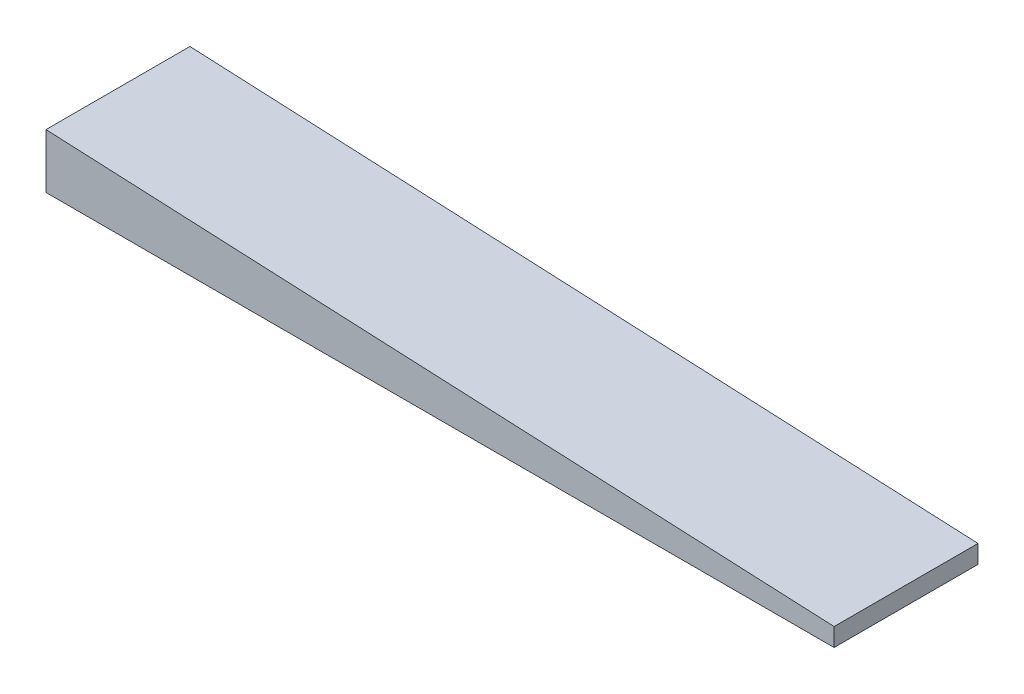
ISO-10303-21;
HEADER;
FILE_DESCRIPTION(('STEP AP214'),'2;1');
FILE_NAME('part.step','',(''),(''),'','','');
FILE_SCHEMA(('AUTOMOTIVE_DESIGN { 1 0 10303 214 1 1 1 1 }'));
ENDSEC;
DATA;
#1=APPLICATION_CONTEXT('core data for automotive mechanical design processes');
#2=APPLICATION_PROTOCOL_DEFINITION('international standard','automotive_design',2000,#1);
#3=PRODUCT_CONTEXT('',#1,'mechanical');
#4=PRODUCT('Part','Part','',(#3));
#5=PRODUCT_RELATED_PRODUCT_CATEGORY('part','',(#4));
#6=PRODUCT_DEFINITION_FORMATION('','',#4);
#7=PRODUCT_DEFINITION_CONTEXT('part definition',#1,'design');
#8=PRODUCT_DEFINITION('design','',#6,#7);
#9=PRODUCT_DEFINITION_SHAPE('','',#8);
#10=(LENGTH_UNIT() NAMED_UNIT(*) SI_UNIT(.MILLI.,.METRE.));
#11=(NAMED_UNIT(*) PLANE_ANGLE_UNIT() SI_UNIT($,.RADIAN.));
#12=(NAMED_UNIT(*) SI_UNIT($,.STERADIAN.) SOLID_ANGLE_UNIT());
#13=UNCERTAINTY_MEASURE_WITH_UNIT(LENGTH_MEASURE(1.E-05),#10,'distance_accuracy_value','');
#14=(GEOMETRIC_REPRESENTATION_CONTEXT(3) GLOBAL_UNCERTAINTY_ASSIGNED_CONTEXT((#13)) GLOBAL_UNIT_ASSIGNED_CONTEXT((#10,
#11,#12)) REPRESENTATION_CONTEXT('',''));
#15=CARTESIAN_POINT('',(0.,0.,0.));
#16=DIRECTION('',(0.,0.,1.));
#17=DIRECTION('',(1.,0.,0.));
#18=AXIS2_PLACEMENT_3D('',#15,#16,#17);
#19=CARTESIAN_POINT('',(0.,0.,38.1));
#20=DIRECTION('',(0.,-1.,0.));
#21=DIRECTION('',(0.,0.,-1.));
#22=AXIS2_PLACEMENT_3D('',#19,#20,#21);
#23=PLANE('',#22);
#24=DIRECTION('',(-1.,0.,0.));
#25=VECTOR('',#24,1.);
#26=CARTESIAN_POINT('',(0.,0.,0.));
#27=LINE('',#26,#25);
#28=CARTESIAN_POINT('',(417.2779588384,0.,0.));
#29=VERTEX_POINT('',#28);
#30=CARTESIAN_POINT('',(208.638979216,0.,0.));
#31=VERTEX_POINT('',#30);
#32=EDGE_CURVE('E106',#29,#31,#27,.T.);
#33=ORIENTED_EDGE('',*,*,#32,.F.);
#34=DIRECTION('',(0.,0.,-1.));
#35=VECTOR('',#34,1.);
#36=CARTESIAN_POINT('',(417.2779588384,0.,38.1));
#37=LINE('',#36,#35);
#38=CARTESIAN_POINT('',(417.2779588384,0.,38.1));
#39=VERTEX_POINT('',#38);
#40=EDGE_CURVE('E11',#39,#29,#37,.T.);
#41=ORIENTED_EDGE('',*,*,#40,.F.);
#42=DIRECTION('',(-1.,0.,0.));
#43=VECTOR('',#42,1.);
#44=CARTESIAN_POINT('',(0.,0.,38.1));
#45=LINE('',#44,#43);
#46=CARTESIAN_POINT('',(208.638979216,0.,38.1));
#47=VERTEX_POINT('',#46);
#48=EDGE_CURVE('E91',#39,#47,#45,.T.);
#49=ORIENTED_EDGE('',*,*,#48,.T.);
#50=DIRECTION('',(0.,0.,-1.));
#51=VECTOR('',#50,1.);
#52=CARTESIAN_POINT('',(208.638979216,0.,38.1));
#53=LINE('',#52,#51);
#54=EDGE_CURVE('E59',#47,#31,#53,.T.);
#55=ORIENTED_EDGE('',*,*,#54,.T.);
#56=EDGE_LOOP('',(#33,#41,#49,#55));
#57=FACE_BOUND('',#56,.T.);
#58=ADVANCED_FACE('F43',(#57),#23,.T.);
#59=CARTESIAN_POINT('',(417.2779588384,0.,38.1));
#60=DIRECTION('',(-1.,0.,0.));
#61=DIRECTION('',(0.,0.,1.));
#62=AXIS2_PLACEMENT_3D('',#59,#60,#61);
#63=PLANE('',#62);
#64=DIRECTION('',(0.,1.,0.));
#65=VECTOR('',#64,1.);
#66=CARTESIAN_POINT('',(417.2779588384,0.,0.));
#67=LINE('',#66,#65);
#68=CARTESIAN_POINT('',(417.2779588384,4.8101015524491,0.));
#69=VERTEX_POINT('',#68);
#70=EDGE_CURVE('E97',#29,#69,#67,.T.);
#71=ORIENTED_EDGE('',*,*,#70,.T.);
#72=DIRECTION('',(0.,0.,-1.));
#73=VECTOR('',#72,1.);
#74=CARTESIAN_POINT('',(417.2779588384,4.8101015524491,38.1));
#75=LINE('',#74,#73);
#76=CARTESIAN_POINT('',(417.2779588384,4.8101015524491,38.1));
#77=VERTEX_POINT('',#76);
#78=EDGE_CURVE('E51',#77,#69,#75,.T.);
#79=ORIENTED_EDGE('',*,*,#78,.F.);
#80=DIRECTION('',(0.,1.,0.));
#81=VECTOR('',#80,1.);
#82=CARTESIAN_POINT('',(417.2779588384,0.,38.1));
#83=LINE('',#82,#81);
#84=EDGE_CURVE('E85',#39,#77,#83,.T.);
#85=ORIENTED_EDGE('',*,*,#84,.F.);
#86=ORIENTED_EDGE('',*,*,#40,.T.);
#87=EDGE_LOOP('',(#71,#79,#85,#86));
#88=FACE_BOUND('',#87,.T.);
#89=ADVANCED_FACE('F95',(#88),#63,.F.);
#90=CARTESIAN_POINT('',(1.1066000381635,23.999483178284,38.1));
#91=DIRECTION('',(0.0460603900408446,0.998938657010172,0.));
#92=DIRECTION('',(-0.998938657010172,0.0460603900408446,0.));
#93=AXIS2_PLACEMENT_3D('',#90,#91,#92);
#94=PLANE('',#93);
#95=DIRECTION('',(0.998938657010172,-0.0460603900408446,0.));
#96=VECTOR('',#95,1.);
#97=CARTESIAN_POINT('',(1.1066000381635,23.999483178284,0.));
#98=LINE('',#97,#96);
#99=CARTESIAN_POINT('',(208.638979216,14.4303046667167,0.));
#100=VERTEX_POINT('',#99);
#101=EDGE_CURVE('E109',#100,#69,#98,.T.);
#102=ORIENTED_EDGE('',*,*,#101,.F.);
#103=DIRECTION('',(0.,0.,-1.));
#104=VECTOR('',#103,1.);
#105=CARTESIAN_POINT('',(208.638979216,14.4303046667167,38.1));
#106=LINE('',#105,#104);
#107=CARTESIAN_POINT('',(208.638979216,14.4303046667167,38.1));
#108=VERTEX_POINT('',#107);
#109=EDGE_CURVE('E72',#108,#100,#106,.T.);
#110=ORIENTED_EDGE('',*,*,#109,.F.);
#111=DIRECTION('',(0.998938657010172,-0.0460603900408446,0.));
#112=VECTOR('',#111,1.);
#113=CARTESIAN_POINT('',(1.1066000381635,23.999483178284,38.1));
#114=LINE('',#113,#112);
#115=EDGE_CURVE('E90',#108,#77,#114,.T.);
#116=ORIENTED_EDGE('',*,*,#115,.T.);
#117=ORIENTED_EDGE('',*,*,#78,.T.);
#118=EDGE_LOOP('',(#102,#110,#116,#117));
#119=FACE_BOUND('',#118,.T.);
#120=ADVANCED_FACE('F100',(#119),#94,.T.);
#121=CARTESIAN_POINT('',(208.638979216,0.,38.1));
#122=DIRECTION('',(-1.,0.,0.));
#123=DIRECTION('',(0.,0.,1.));
#124=AXIS2_PLACEMENT_3D('',#121,#122,#123);
#125=PLANE('',#124);
#126=DIRECTION('',(0.,1.,0.));
#127=VECTOR('',#126,1.);
#128=CARTESIAN_POINT('',(208.638979216,0.,0.));
#129=LINE('',#128,#127);
#130=EDGE_CURVE('E111',#31,#100,#129,.T.);
#131=ORIENTED_EDGE('',*,*,#130,.F.);
#132=ORIENTED_EDGE('',*,*,#54,.F.);
#133=DIRECTION('',(0.,1.,0.));
#134=VECTOR('',#133,1.);
#135=CARTESIAN_POINT('',(208.638979216,0.,38.1));
#136=LINE('',#135,#134);
#137=EDGE_CURVE('E101',#47,#108,#136,.T.);
#138=ORIENTED_EDGE('',*,*,#137,.T.);
#139=ORIENTED_EDGE('',*,*,#109,.T.);
#140=EDGE_LOOP('',(#131,#132,#138,#139));
#141=FACE_BOUND('',#140,.T.);
#142=ADVANCED_FACE('F116',(#141),#125,.T.);
#143=CARTESIAN_POINT('',(0.,0.,38.1));
#144=DIRECTION('',(0.,0.,1.));
#145=DIRECTION('',(1.,0.,0.));
#146=AXIS2_PLACEMENT_3D('',#143,#144,#145);
#147=PLANE('',#146);
#148=ORIENTED_EDGE('',*,*,#48,.F.);
#149=ORIENTED_EDGE('',*,*,#84,.T.);
#150=ORIENTED_EDGE('',*,*,#115,.F.);
#151=ORIENTED_EDGE('',*,*,#137,.F.);
#152=EDGE_LOOP('',(#148,#149,#150,#151));
#153=FACE_BOUND('',#152,.T.);
#154=ADVANCED_FACE('F87',(#153),#147,.T.);
#155=CARTESIAN_POINT('',(0.,0.,0.));
#156=DIRECTION('',(0.,0.,1.));
#157=DIRECTION('',(1.,0.,0.));
#158=AXIS2_PLACEMENT_3D('',#155,#156,#157);
#159=PLANE('',#158);
#160=ORIENTED_EDGE('',*,*,#32,.T.);
#161=ORIENTED_EDGE('',*,*,#130,.T.);
#162=ORIENTED_EDGE('',*,*,#101,.T.);
#163=ORIENTED_EDGE('',*,*,#70,.F.);
#164=EDGE_LOOP('',(#160,#161,#162,#163));
#165=FACE_BOUND('',#164,.T.);
#166=ADVANCED_FACE('F123',(#165),#159,.F.);
#167=CLOSED_SHELL('',(#58,#89,#120,#142,#154,#166));
#168=MANIFOLD_SOLID_BREP('B2',#167);
#169=ADVANCED_BREP_SHAPE_REPRESENTATION('',(#18,#168),#14);
#170=SHAPE_DEFINITION_REPRESENTATION(#9,#169);
ENDSEC;
END-ISO-10303-21;
